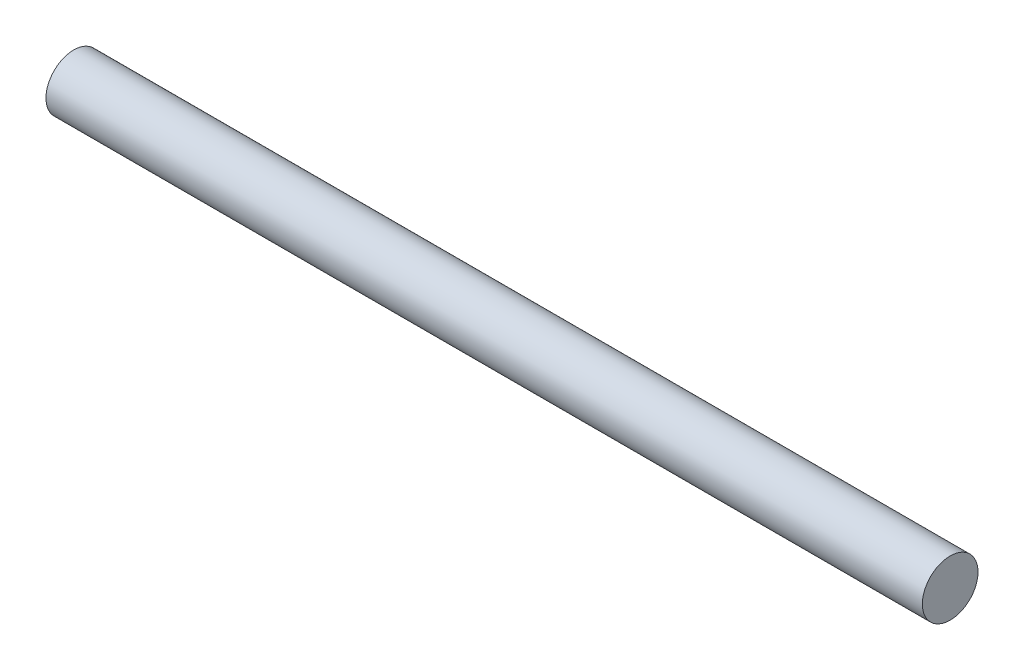
ISO-10303-21;
HEADER;
FILE_DESCRIPTION(('STEP AP214'),'2;1');
FILE_NAME('part.step','',(''),(''),'','','');
FILE_SCHEMA(('AUTOMOTIVE_DESIGN { 1 0 10303 214 1 1 1 1 }'));
ENDSEC;
DATA;
#1=APPLICATION_CONTEXT('core data for automotive mechanical design processes');
#2=APPLICATION_PROTOCOL_DEFINITION('international standard','automotive_design',2000,#1);
#3=PRODUCT_CONTEXT('',#1,'mechanical');
#4=PRODUCT('Part','Part','',(#3));
#5=PRODUCT_RELATED_PRODUCT_CATEGORY('part','',(#4));
#6=PRODUCT_DEFINITION_FORMATION('','',#4);
#7=PRODUCT_DEFINITION_CONTEXT('part definition',#1,'design');
#8=PRODUCT_DEFINITION('design','',#6,#7);
#9=PRODUCT_DEFINITION_SHAPE('','',#8);
#10=(LENGTH_UNIT() NAMED_UNIT(*) SI_UNIT(.MILLI.,.METRE.));
#11=(NAMED_UNIT(*) PLANE_ANGLE_UNIT() SI_UNIT($,.RADIAN.));
#12=(NAMED_UNIT(*) SI_UNIT($,.STERADIAN.) SOLID_ANGLE_UNIT());
#13=UNCERTAINTY_MEASURE_WITH_UNIT(LENGTH_MEASURE(1.E-05),#10,'distance_accuracy_value','');
#14=(GEOMETRIC_REPRESENTATION_CONTEXT(3) GLOBAL_UNCERTAINTY_ASSIGNED_CONTEXT((#13)) GLOBAL_UNIT_ASSIGNED_CONTEXT((#10,
#11,#12)) REPRESENTATION_CONTEXT('',''));
#15=CARTESIAN_POINT('',(0.,0.,0.));
#16=DIRECTION('',(0.,0.,1.));
#17=DIRECTION('',(1.,0.,0.));
#18=AXIS2_PLACEMENT_3D('',#15,#16,#17);
#19=CARTESIAN_POINT('',(75.,0.,0.));
#20=DIRECTION('',(-1.,0.,0.));
#21=DIRECTION('',(0.,0.,1.));
#22=AXIS2_PLACEMENT_3D('',#19,#20,#21);
#23=CYLINDRICAL_SURFACE('',#22,4.7625);
#24=CARTESIAN_POINT('',(75.,0.,0.));
#25=DIRECTION('',(1.,0.,0.));
#26=DIRECTION('',(0.,0.,-1.));
#27=AXIS2_PLACEMENT_3D('',#24,#25,#26);
#28=CIRCLE('',#27,4.7625);
#29=CARTESIAN_POINT('',(75.,0.,-4.7625));
#30=VERTEX_POINT('',#29);
#31=EDGE_CURVE('E10',#30,#30,#28,.T.);
#32=ORIENTED_EDGE('',*,*,#31,.F.);
#33=EDGE_LOOP('',(#32));
#34=FACE_BOUND('',#33,.T.);
#35=CARTESIAN_POINT('',(-75.,0.,0.));
#36=DIRECTION('',(1.,0.,0.));
#37=DIRECTION('',(0.,0.,-1.));
#38=AXIS2_PLACEMENT_3D('',#35,#36,#37);
#39=CIRCLE('',#38,4.7625);
#40=CARTESIAN_POINT('',(-75.,0.,-4.7625));
#41=VERTEX_POINT('',#40);
#42=EDGE_CURVE('E34',#41,#41,#39,.T.);
#43=ORIENTED_EDGE('',*,*,#42,.T.);
#44=EDGE_LOOP('',(#43));
#45=FACE_BOUND('',#44,.T.);
#46=ADVANCED_FACE('F31',(#34,#45),#23,.T.);
#47=CARTESIAN_POINT('',(75.,0.,0.));
#48=DIRECTION('',(1.,0.,0.));
#49=DIRECTION('',(0.,0.,-1.));
#50=AXIS2_PLACEMENT_3D('',#47,#48,#49);
#51=PLANE('',#50);
#52=ORIENTED_EDGE('',*,*,#31,.T.);
#53=EDGE_LOOP('',(#52));
#54=FACE_BOUND('',#53,.T.);
#55=ADVANCED_FACE('F46',(#54),#51,.T.);
#56=CARTESIAN_POINT('',(-75.,0.,0.));
#57=DIRECTION('',(1.,0.,0.));
#58=DIRECTION('',(0.,0.,-1.));
#59=AXIS2_PLACEMENT_3D('',#56,#57,#58);
#60=PLANE('',#59);
#61=ORIENTED_EDGE('',*,*,#42,.F.);
#62=EDGE_LOOP('',(#61));
#63=FACE_BOUND('',#62,.T.);
#64=ADVANCED_FACE('F44',(#63),#60,.F.);
#65=CLOSED_SHELL('',(#46,#55,#64));
#66=MANIFOLD_SOLID_BREP('B2',#65);
#67=ADVANCED_BREP_SHAPE_REPRESENTATION('',(#18,#66),#14);
#68=SHAPE_DEFINITION_REPRESENTATION(#9,#67);
ENDSEC;
END-ISO-10303-21;
